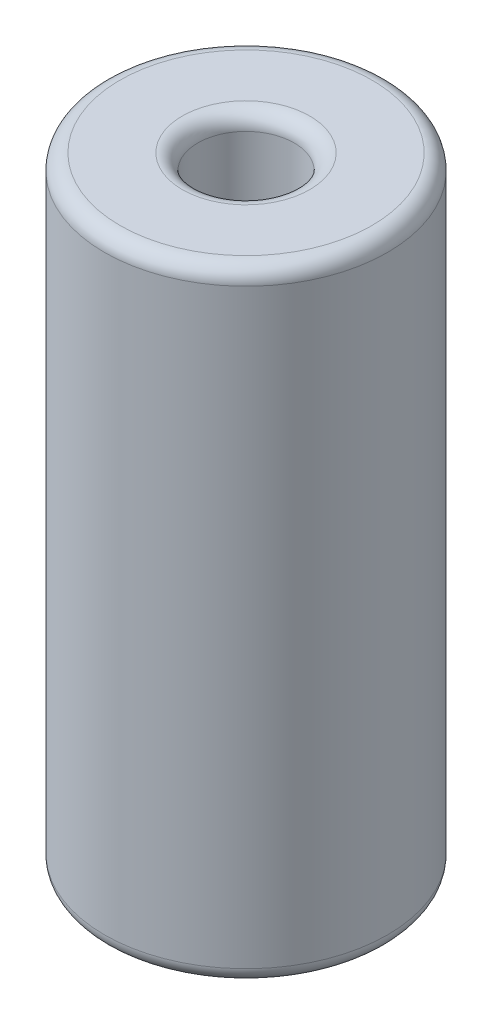
ISO-10303-21;
HEADER;
FILE_DESCRIPTION(('STEP AP214'),'2;1');
FILE_NAME('part.step','',(''),(''),'','','');
FILE_SCHEMA(('AUTOMOTIVE_DESIGN { 1 0 10303 214 1 1 1 1 }'));
ENDSEC;
DATA;
#1=APPLICATION_CONTEXT('core data for automotive mechanical design processes');
#2=APPLICATION_PROTOCOL_DEFINITION('international standard','automotive_design',2000,#1);
#3=PRODUCT_CONTEXT('',#1,'mechanical');
#4=PRODUCT('Part','Part','',(#3));
#5=PRODUCT_RELATED_PRODUCT_CATEGORY('part','',(#4));
#6=PRODUCT_DEFINITION_FORMATION('','',#4);
#7=PRODUCT_DEFINITION_CONTEXT('part definition',#1,'design');
#8=PRODUCT_DEFINITION('design','',#6,#7);
#9=PRODUCT_DEFINITION_SHAPE('','',#8);
#10=(LENGTH_UNIT() NAMED_UNIT(*) SI_UNIT(.MILLI.,.METRE.));
#11=(NAMED_UNIT(*) PLANE_ANGLE_UNIT() SI_UNIT($,.RADIAN.));
#12=(NAMED_UNIT(*) SI_UNIT($,.STERADIAN.) SOLID_ANGLE_UNIT());
#13=UNCERTAINTY_MEASURE_WITH_UNIT(LENGTH_MEASURE(1.E-05),#10,'distance_accuracy_value','');
#14=(GEOMETRIC_REPRESENTATION_CONTEXT(3) GLOBAL_UNCERTAINTY_ASSIGNED_CONTEXT((#13)) GLOBAL_UNIT_ASSIGNED_CONTEXT((#10,
#11,#12)) REPRESENTATION_CONTEXT('',''));
#15=CARTESIAN_POINT('',(0.,0.,0.));
#16=DIRECTION('',(0.,0.,1.));
#17=DIRECTION('',(1.,0.,0.));
#18=AXIS2_PLACEMENT_3D('',#15,#16,#17);
#19=CARTESIAN_POINT('',(0.,20.,0.));
#20=DIRECTION('',(0.,1.,0.));
#21=DIRECTION('',(0.,0.,1.));
#22=AXIS2_PLACEMENT_3D('',#19,#20,#21);
#23=PLANE('',#22);
#24=CARTESIAN_POINT('',(0.,20.,0.));
#25=DIRECTION('',(0.,1.,0.));
#26=DIRECTION('',(0.,0.,1.));
#27=AXIS2_PLACEMENT_3D('',#24,#25,#26);
#28=CIRCLE('',#27,2.05);
#29=CARTESIAN_POINT('',(0.,20.,2.05));
#30=VERTEX_POINT('',#29);
#31=EDGE_CURVE('E47',#30,#30,#28,.F.);
#32=ORIENTED_EDGE('',*,*,#31,.T.);
#33=EDGE_LOOP('',(#32));
#34=FACE_BOUND('',#33,.T.);
#35=CARTESIAN_POINT('',(0.,20.,0.));
#36=DIRECTION('',(0.,1.,0.));
#37=DIRECTION('',(0.,0.,1.));
#38=AXIS2_PLACEMENT_3D('',#35,#36,#37);
#39=CIRCLE('',#38,4.05);
#40=CARTESIAN_POINT('',(0.,20.,4.05));
#41=VERTEX_POINT('',#40);
#42=EDGE_CURVE('E51',#41,#41,#39,.T.);
#43=ORIENTED_EDGE('',*,*,#42,.T.);
#44=EDGE_LOOP('',(#43));
#45=FACE_BOUND('',#44,.T.);
#46=ADVANCED_FACE('F36',(#34,#45),#23,.T.);
#47=CARTESIAN_POINT('',(0.,0.,0.));
#48=DIRECTION('',(0.,1.,0.));
#49=DIRECTION('',(0.,0.,1.));
#50=AXIS2_PLACEMENT_3D('',#47,#48,#49);
#51=PLANE('',#50);
#52=CARTESIAN_POINT('',(0.,0.,0.));
#53=DIRECTION('',(0.,1.,0.));
#54=DIRECTION('',(0.,0.,1.));
#55=AXIS2_PLACEMENT_3D('',#52,#53,#54);
#56=CIRCLE('',#55,2.05);
#57=CARTESIAN_POINT('',(0.,0.,2.05));
#58=VERTEX_POINT('',#57);
#59=EDGE_CURVE('E62',#58,#58,#56,.T.);
#60=ORIENTED_EDGE('',*,*,#59,.T.);
#61=EDGE_LOOP('',(#60));
#62=FACE_BOUND('',#61,.T.);
#63=CARTESIAN_POINT('',(0.,0.,0.));
#64=DIRECTION('',(0.,1.,0.));
#65=DIRECTION('',(0.,0.,1.));
#66=AXIS2_PLACEMENT_3D('',#63,#64,#65);
#67=CIRCLE('',#66,4.05);
#68=CARTESIAN_POINT('',(0.,0.,4.05));
#69=VERTEX_POINT('',#68);
#70=EDGE_CURVE('E65',#69,#69,#67,.F.);
#71=ORIENTED_EDGE('',*,*,#70,.T.);
#72=EDGE_LOOP('',(#71));
#73=FACE_BOUND('',#72,.T.);
#74=ADVANCED_FACE('F69',(#62,#73),#51,.F.);
#75=CARTESIAN_POINT('',(0.,20.,0.));
#76=DIRECTION('',(0.,-1.,0.));
#77=DIRECTION('',(0.,0.,-1.));
#78=AXIS2_PLACEMENT_3D('',#75,#76,#77);
#79=CYLINDRICAL_SURFACE('',#78,4.55);
#80=CARTESIAN_POINT('',(0.,0.5,0.));
#81=DIRECTION('',(0.,1.,0.));
#82=DIRECTION('',(0.,0.,1.));
#83=AXIS2_PLACEMENT_3D('',#80,#81,#82);
#84=CIRCLE('',#83,4.55);
#85=CARTESIAN_POINT('',(0.,0.5,4.55));
#86=VERTEX_POINT('',#85);
#87=EDGE_CURVE('E10',#86,#86,#84,.T.);
#88=ORIENTED_EDGE('',*,*,#87,.T.);
#89=EDGE_LOOP('',(#88));
#90=FACE_BOUND('',#89,.T.);
#91=CARTESIAN_POINT('',(0.,19.5,0.));
#92=DIRECTION('',(0.,1.,0.));
#93=DIRECTION('',(0.,0.,1.));
#94=AXIS2_PLACEMENT_3D('',#91,#92,#93);
#95=CIRCLE('',#94,4.55);
#96=CARTESIAN_POINT('',(0.,19.5,4.55));
#97=VERTEX_POINT('',#96);
#98=EDGE_CURVE('E43',#97,#97,#95,.F.);
#99=ORIENTED_EDGE('',*,*,#98,.T.);
#100=EDGE_LOOP('',(#99));
#101=FACE_BOUND('',#100,.T.);
#102=ADVANCED_FACE('F89',(#90,#101),#79,.T.);
#103=CARTESIAN_POINT('',(0.,20.,0.));
#104=DIRECTION('',(0.,-1.,0.));
#105=DIRECTION('',(0.,0.,-1.));
#106=AXIS2_PLACEMENT_3D('',#103,#104,#105);
#107=CYLINDRICAL_SURFACE('',#106,1.55);
#108=CARTESIAN_POINT('',(0.,0.5,0.));
#109=DIRECTION('',(0.,1.,0.));
#110=DIRECTION('',(0.,0.,1.));
#111=AXIS2_PLACEMENT_3D('',#108,#109,#110);
#112=CIRCLE('',#111,1.55);
#113=CARTESIAN_POINT('',(0.,0.5,1.55));
#114=VERTEX_POINT('',#113);
#115=EDGE_CURVE('E56',#114,#114,#112,.F.);
#116=ORIENTED_EDGE('',*,*,#115,.T.);
#117=EDGE_LOOP('',(#116));
#118=FACE_BOUND('',#117,.T.);
#119=CARTESIAN_POINT('',(0.,19.5,0.));
#120=DIRECTION('',(0.,1.,0.));
#121=DIRECTION('',(0.,0.,1.));
#122=AXIS2_PLACEMENT_3D('',#119,#120,#121);
#123=CIRCLE('',#122,1.55);
#124=CARTESIAN_POINT('',(0.,19.5,1.55));
#125=VERTEX_POINT('',#124);
#126=EDGE_CURVE('E59',#125,#125,#123,.T.);
#127=ORIENTED_EDGE('',*,*,#126,.T.);
#128=EDGE_LOOP('',(#127));
#129=FACE_BOUND('',#128,.T.);
#130=ADVANCED_FACE('F94',(#118,#129),#107,.F.);
#131=CARTESIAN_POINT('',(0.,0.5,0.));
#132=DIRECTION('',(0.,1.,0.));
#133=DIRECTION('',(0.,0.,1.));
#134=AXIS2_PLACEMENT_3D('',#131,#132,#133);
#135=TOROIDAL_SURFACE('',#134,2.05,0.5);
#136=ORIENTED_EDGE('',*,*,#115,.F.);
#137=EDGE_LOOP('',(#136));
#138=FACE_BOUND('',#137,.T.);
#139=ORIENTED_EDGE('',*,*,#59,.F.);
#140=EDGE_LOOP('',(#139));
#141=FACE_BOUND('',#140,.T.);
#142=ADVANCED_FACE('F80',(#138,#141),#135,.T.);
#143=CARTESIAN_POINT('',(0.,19.5,0.));
#144=DIRECTION('',(0.,1.,0.));
#145=DIRECTION('',(0.,0.,1.));
#146=AXIS2_PLACEMENT_3D('',#143,#144,#145);
#147=TOROIDAL_SURFACE('',#146,2.05,0.5);
#148=ORIENTED_EDGE('',*,*,#31,.F.);
#149=EDGE_LOOP('',(#148));
#150=FACE_BOUND('',#149,.T.);
#151=ORIENTED_EDGE('',*,*,#126,.F.);
#152=EDGE_LOOP('',(#151));
#153=FACE_BOUND('',#152,.T.);
#154=ADVANCED_FACE('F74',(#150,#153),#147,.T.);
#155=CARTESIAN_POINT('',(0.,0.5,0.));
#156=DIRECTION('',(0.,1.,0.));
#157=DIRECTION('',(0.,0.,1.));
#158=AXIS2_PLACEMENT_3D('',#155,#156,#157);
#159=TOROIDAL_SURFACE('',#158,4.05,0.5);
#160=ORIENTED_EDGE('',*,*,#70,.F.);
#161=EDGE_LOOP('',(#160));
#162=FACE_BOUND('',#161,.T.);
#163=ORIENTED_EDGE('',*,*,#87,.F.);
#164=EDGE_LOOP('',(#163));
#165=FACE_BOUND('',#164,.T.);
#166=ADVANCED_FACE('F71',(#162,#165),#159,.T.);
#167=CARTESIAN_POINT('',(0.,19.5,0.));
#168=DIRECTION('',(0.,1.,0.));
#169=DIRECTION('',(0.,0.,1.));
#170=AXIS2_PLACEMENT_3D('',#167,#168,#169);
#171=TOROIDAL_SURFACE('',#170,4.05,0.5);
#172=ORIENTED_EDGE('',*,*,#98,.F.);
#173=EDGE_LOOP('',(#172));
#174=FACE_BOUND('',#173,.T.);
#175=ORIENTED_EDGE('',*,*,#42,.F.);
#176=EDGE_LOOP('',(#175));
#177=FACE_BOUND('',#176,.T.);
#178=ADVANCED_FACE('F38',(#174,#177),#171,.T.);
#179=CLOSED_SHELL('',(#46,#74,#102,#130,#142,#154,#166,#178));
#180=MANIFOLD_SOLID_BREP('B2',#179);
#181=ADVANCED_BREP_SHAPE_REPRESENTATION('',(#18,#180),#14);
#182=SHAPE_DEFINITION_REPRESENTATION(#9,#181);
ENDSEC;
END-ISO-10303-21;
